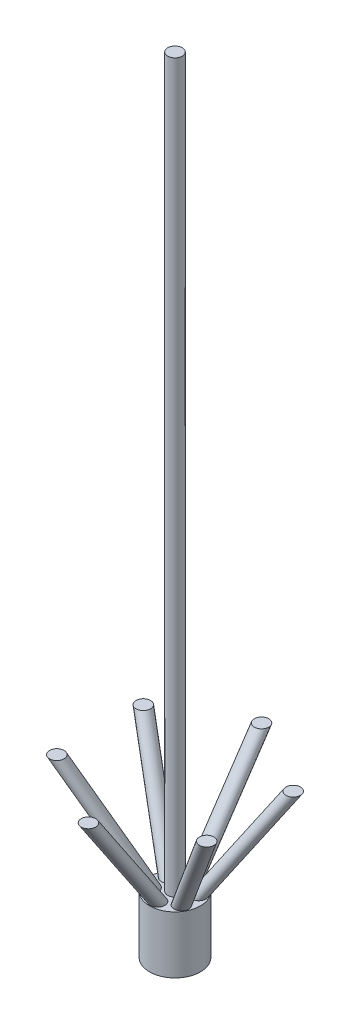
ISO-10303-21;
HEADER;
FILE_DESCRIPTION(('STEP AP214'),'2;1');
FILE_NAME('part.step','',(''),(''),'','','');
FILE_SCHEMA(('AUTOMOTIVE_DESIGN { 1 0 10303 214 1 1 1 1 }'));
ENDSEC;
DATA;
#1=APPLICATION_CONTEXT('core data for automotive mechanical design processes');
#2=APPLICATION_PROTOCOL_DEFINITION('international standard','automotive_design',2000,#1);
#3=PRODUCT_CONTEXT('',#1,'mechanical');
#4=PRODUCT('Part','Part','',(#3));
#5=PRODUCT_RELATED_PRODUCT_CATEGORY('part','',(#4));
#6=PRODUCT_DEFINITION_FORMATION('','',#4);
#7=PRODUCT_DEFINITION_CONTEXT('part definition',#1,'design');
#8=PRODUCT_DEFINITION('design','',#6,#7);
#9=PRODUCT_DEFINITION_SHAPE('','',#8);
#10=(LENGTH_UNIT() NAMED_UNIT(*) SI_UNIT(.MILLI.,.METRE.));
#11=(NAMED_UNIT(*) PLANE_ANGLE_UNIT() SI_UNIT($,.RADIAN.));
#12=(NAMED_UNIT(*) SI_UNIT($,.STERADIAN.) SOLID_ANGLE_UNIT());
#13=UNCERTAINTY_MEASURE_WITH_UNIT(LENGTH_MEASURE(1.E-05),#10,'distance_accuracy_value','');
#14=(GEOMETRIC_REPRESENTATION_CONTEXT(3) GLOBAL_UNCERTAINTY_ASSIGNED_CONTEXT((#13)) GLOBAL_UNIT_ASSIGNED_CONTEXT((#10,
#11,#12)) REPRESENTATION_CONTEXT('',''));
#15=CARTESIAN_POINT('',(0.,0.,0.));
#16=DIRECTION('',(0.,0.,1.));
#17=DIRECTION('',(1.,0.,0.));
#18=AXIS2_PLACEMENT_3D('',#15,#16,#17);
#19=CARTESIAN_POINT('',(0.,1.,0.));
#20=DIRECTION('',(0.,1.,0.));
#21=DIRECTION('',(0.,0.,1.));
#22=AXIS2_PLACEMENT_3D('',#19,#20,#21);
#23=PLANE('',#22);
#24=CARTESIAN_POINT('',(0.263964543073501,1.,0.152399999999997));
#25=DIRECTION('',(0.,1.,0.));
#26=DIRECTION('',(-0.866025403784443,0.,-0.499999999999992));
#27=AXIS2_PLACEMENT_3D('',#24,#25,#26);
#28=CIRCLE('',#27,0.127);
#29=CARTESIAN_POINT('',(0.153979316792877,1.,0.088899999999998));
#30=VERTEX_POINT('',#29);
#31=EDGE_CURVE('E282',#30,#30,#28,.T.);
#32=ORIENTED_EDGE('',*,*,#31,.F.);
#33=EDGE_LOOP('',(#32));
#34=FACE_BOUND('',#33,.T.);
#35=CARTESIAN_POINT('',(-0.263964543073494,1.,0.152399999999997));
#36=DIRECTION('',(0.,1.,0.));
#37=DIRECTION('',(0.866025403784436,0.,-0.500000000000004));
#38=AXIS2_PLACEMENT_3D('',#35,#36,#37);
#39=CIRCLE('',#38,0.127);
#40=CARTESIAN_POINT('',(-0.153979316792871,1.,0.0888999999999965));
#41=VERTEX_POINT('',#40);
#42=EDGE_CURVE('E299',#41,#41,#39,.T.);
#43=ORIENTED_EDGE('',*,*,#42,.F.);
#44=EDGE_LOOP('',(#43));
#45=FACE_BOUND('',#44,.T.);
#46=CARTESIAN_POINT('',(0.,1.,-0.304799999999994));
#47=DIRECTION('',(0.,1.,0.));
#48=DIRECTION('',(0.,0.,1.));
#49=AXIS2_PLACEMENT_3D('',#46,#47,#48);
#50=CIRCLE('',#49,0.127);
#51=CARTESIAN_POINT('',(0.,1.,-0.177799999999994));
#52=VERTEX_POINT('',#51);
#53=EDGE_CURVE('E63',#52,#52,#50,.T.);
#54=ORIENTED_EDGE('',*,*,#53,.F.);
#55=EDGE_LOOP('',(#54));
#56=FACE_BOUND('',#55,.T.);
#57=CARTESIAN_POINT('',(0.,1.,0.));
#58=DIRECTION('',(0.,1.,0.));
#59=DIRECTION('',(0.,0.,1.));
#60=AXIS2_PLACEMENT_3D('',#57,#58,#59);
#61=CIRCLE('',#60,0.4445);
#62=CARTESIAN_POINT('',(0.,1.,0.4445));
#63=VERTEX_POINT('',#62);
#64=EDGE_CURVE('E10',#63,#63,#61,.T.);
#65=ORIENTED_EDGE('',*,*,#64,.T.);
#66=EDGE_LOOP('',(#65));
#67=FACE_BOUND('',#66,.T.);
#68=CARTESIAN_POINT('',(0.,1.,0.));
#69=DIRECTION('',(0.,1.,0.));
#70=DIRECTION('',(0.,0.,1.));
#71=AXIS2_PLACEMENT_3D('',#68,#69,#70);
#72=CIRCLE('',#71,0.127);
#73=CARTESIAN_POINT('',(0.,1.,0.127));
#74=VERTEX_POINT('',#73);
#75=EDGE_CURVE('E55',#74,#74,#72,.T.);
#76=ORIENTED_EDGE('',*,*,#75,.F.);
#77=EDGE_LOOP('',(#76));
#78=FACE_BOUND('',#77,.T.);
#79=CARTESIAN_POINT('',(-0.263964543073494,1.,-0.152399999999997));
#80=DIRECTION('',(0.,1.,0.));
#81=DIRECTION('',(0.86602540378444,0.,0.499999999999998));
#82=AXIS2_PLACEMENT_3D('',#79,#80,#81);
#83=CIRCLE('',#82,0.127);
#84=CARTESIAN_POINT('',(-0.153979316792871,1.,-0.0888999999999972));
#85=VERTEX_POINT('',#84);
#86=EDGE_CURVE('E72',#85,#85,#83,.T.);
#87=ORIENTED_EDGE('',*,*,#86,.F.);
#88=EDGE_LOOP('',(#87));
#89=FACE_BOUND('',#88,.T.);
#90=CARTESIAN_POINT('',(0.,1.,0.304799999999994));
#91=DIRECTION('',(0.,1.,0.));
#92=DIRECTION('',(0.,0.,-1.));
#93=AXIS2_PLACEMENT_3D('',#90,#91,#92);
#94=CIRCLE('',#93,0.127);
#95=CARTESIAN_POINT('',(0.,1.,0.177799999999994));
#96=VERTEX_POINT('',#95);
#97=EDGE_CURVE('E292',#96,#96,#94,.T.);
#98=ORIENTED_EDGE('',*,*,#97,.F.);
#99=EDGE_LOOP('',(#98));
#100=FACE_BOUND('',#99,.T.);
#101=CARTESIAN_POINT('',(0.263964543073494,1.,-0.152399999999997));
#102=DIRECTION('',(0.,1.,0.));
#103=DIRECTION('',(-0.866025403784433,0.,0.50000000000001));
#104=AXIS2_PLACEMENT_3D('',#101,#102,#103);
#105=CIRCLE('',#104,0.127);
#106=CARTESIAN_POINT('',(0.153979316792871,1.,-0.0888999999999957));
#107=VERTEX_POINT('',#106);
#108=EDGE_CURVE('E283',#107,#107,#105,.T.);
#109=ORIENTED_EDGE('',*,*,#108,.F.);
#110=EDGE_LOOP('',(#109));
#111=FACE_BOUND('',#110,.T.);
#112=ADVANCED_FACE('F40',(#34,#45,#56,#67,#78,#89,#100,#111),#23,.T.);
#113=CARTESIAN_POINT('',(0.,1.,0.));
#114=DIRECTION('',(0.,-1.,0.));
#115=DIRECTION('',(0.,0.,-1.));
#116=AXIS2_PLACEMENT_3D('',#113,#114,#115);
#117=CYLINDRICAL_SURFACE('',#116,0.4445);
#118=ORIENTED_EDGE('',*,*,#64,.F.);
#119=EDGE_LOOP('',(#118));
#120=FACE_BOUND('',#119,.T.);
#121=CARTESIAN_POINT('',(0.,0.,0.));
#122=DIRECTION('',(0.,1.,0.));
#123=DIRECTION('',(0.,0.,1.));
#124=AXIS2_PLACEMENT_3D('',#121,#122,#123);
#125=CIRCLE('',#124,0.4445);
#126=CARTESIAN_POINT('',(0.,0.,0.4445));
#127=VERTEX_POINT('',#126);
#128=EDGE_CURVE('E44',#127,#127,#125,.T.);
#129=ORIENTED_EDGE('',*,*,#128,.T.);
#130=EDGE_LOOP('',(#129));
#131=FACE_BOUND('',#130,.T.);
#132=ADVANCED_FACE('F42',(#120,#131),#117,.T.);
#133=CARTESIAN_POINT('',(0.,0.,0.));
#134=DIRECTION('',(0.,1.,0.));
#135=DIRECTION('',(0.,0.,1.));
#136=AXIS2_PLACEMENT_3D('',#133,#134,#135);
#137=PLANE('',#136);
#138=ORIENTED_EDGE('',*,*,#128,.F.);
#139=EDGE_LOOP('',(#138));
#140=FACE_BOUND('',#139,.T.);
#141=ADVANCED_FACE('F89',(#140),#137,.F.);
#142=CARTESIAN_POINT('',(0.,13.7,0.));
#143=DIRECTION('',(0.,-1.,0.));
#144=DIRECTION('',(0.,0.,-1.));
#145=AXIS2_PLACEMENT_3D('',#142,#143,#144);
#146=CYLINDRICAL_SURFACE('',#145,0.127);
#147=CARTESIAN_POINT('',(0.,13.7,0.));
#148=DIRECTION('',(0.,1.,0.));
#149=DIRECTION('',(0.,0.,1.));
#150=AXIS2_PLACEMENT_3D('',#147,#148,#149);
#151=CIRCLE('',#150,0.127);
#152=CARTESIAN_POINT('',(0.,13.7,0.127));
#153=VERTEX_POINT('',#152);
#154=EDGE_CURVE('E53',#153,#153,#151,.T.);
#155=ORIENTED_EDGE('',*,*,#154,.F.);
#156=EDGE_LOOP('',(#155));
#157=FACE_BOUND('',#156,.T.);
#158=ORIENTED_EDGE('',*,*,#75,.T.);
#159=EDGE_LOOP('',(#158));
#160=FACE_BOUND('',#159,.T.);
#161=ADVANCED_FACE('F85',(#157,#160),#146,.T.);
#162=CARTESIAN_POINT('',(0.,13.7,0.));
#163=DIRECTION('',(0.,1.,0.));
#164=DIRECTION('',(0.,0.,1.));
#165=AXIS2_PLACEMENT_3D('',#162,#163,#164);
#166=PLANE('',#165);
#167=ORIENTED_EDGE('',*,*,#154,.T.);
#168=EDGE_LOOP('',(#167));
#169=FACE_BOUND('',#168,.T.);
#170=ADVANCED_FACE('F80',(#169),#166,.T.);
#171=CARTESIAN_POINT('',(0.,2.78989211914633,-1.51209747859335));
#172=DIRECTION('',(0.,1.,0.));
#173=DIRECTION('',(0.,0.,1.));
#174=AXIS2_PLACEMENT_3D('',#171,#172,#173);
#175=CIRCLE('',#174,0.127);
#176=DIRECTION('',(0.,-0.829037572555041,0.559192903470748));
#177=VECTOR('',#176,1.);
#178=SURFACE_OF_LINEAR_EXTRUSION('',#175,#177);
#179=CARTESIAN_POINT('',(0.,2.78989211914633,-1.38509747859335));
#180=VERTEX_POINT('',#179);
#181=EDGE_CURVE('E59',#180,#180,#175,.T.);
#182=ORIENTED_EDGE('',*,*,#181,.F.);
#183=EDGE_LOOP('',(#182));
#184=FACE_BOUND('',#183,.T.);
#185=ORIENTED_EDGE('',*,*,#53,.T.);
#186=EDGE_LOOP('',(#185));
#187=FACE_BOUND('',#186,.T.);
#188=ADVANCED_FACE('F75',(#184,#187),#178,.F.);
#189=CARTESIAN_POINT('',(0.,2.78989211914633,-1.51209747859335));
#190=DIRECTION('',(0.,1.,0.));
#191=DIRECTION('',(0.,0.,1.));
#192=AXIS2_PLACEMENT_3D('',#189,#190,#191);
#193=PLANE('',#192);
#194=ORIENTED_EDGE('',*,*,#181,.T.);
#195=EDGE_LOOP('',(#194));
#196=FACE_BOUND('',#195,.T.);
#197=ADVANCED_FACE('F79',(#196),#193,.T.);
#198=CARTESIAN_POINT('',(-1.30951482946023,2.78989211914633,-0.756048739296675));
#199=DIRECTION('',(0.,1.,0.));
#200=DIRECTION('',(0.86602540378444,0.,0.499999999999998));
#201=AXIS2_PLACEMENT_3D('',#198,#199,#200);
#202=CIRCLE('',#201,0.127);
#203=DIRECTION('',(0.484275260021648,-0.829037572555041,0.279596451735373));
#204=VECTOR('',#203,1.);
#205=SURFACE_OF_LINEAR_EXTRUSION('',#202,#204);
#206=CARTESIAN_POINT('',(-1.19952960317961,2.78989211914633,-0.692548739296675));
#207=VERTEX_POINT('',#206);
#208=EDGE_CURVE('E67',#207,#207,#202,.T.);
#209=ORIENTED_EDGE('',*,*,#208,.F.);
#210=EDGE_LOOP('',(#209));
#211=FACE_BOUND('',#210,.T.);
#212=ORIENTED_EDGE('',*,*,#86,.T.);
#213=EDGE_LOOP('',(#212));
#214=FACE_BOUND('',#213,.T.);
#215=ADVANCED_FACE('F151',(#211,#214),#205,.F.);
#216=CARTESIAN_POINT('',(-1.30951482946023,2.78989211914633,-0.756048739296675));
#217=DIRECTION('',(0.,1.,0.));
#218=DIRECTION('',(0.86602540378444,0.,0.499999999999998));
#219=AXIS2_PLACEMENT_3D('',#216,#217,#218);
#220=PLANE('',#219);
#221=ORIENTED_EDGE('',*,*,#208,.T.);
#222=EDGE_LOOP('',(#221));
#223=FACE_BOUND('',#222,.T.);
#224=ADVANCED_FACE('F160',(#223),#220,.T.);
#225=CARTESIAN_POINT('',(-1.30951482946023,2.78989211914633,0.756048739296675));
#226=DIRECTION('',(0.,1.,0.));
#227=DIRECTION('',(0.866025403784436,0.,-0.500000000000004));
#228=AXIS2_PLACEMENT_3D('',#225,#226,#227);
#229=CIRCLE('',#228,0.127);
#230=DIRECTION('',(0.484275260021646,-0.829037572555041,-0.279596451735376));
#231=VECTOR('',#230,1.);
#232=SURFACE_OF_LINEAR_EXTRUSION('',#229,#231);
#233=CARTESIAN_POINT('',(-1.1995296031796,2.78989211914633,0.692548739296674));
#234=VERTEX_POINT('',#233);
#235=EDGE_CURVE('E303',#234,#234,#229,.T.);
#236=ORIENTED_EDGE('',*,*,#235,.F.);
#237=EDGE_LOOP('',(#236));
#238=FACE_BOUND('',#237,.T.);
#239=ORIENTED_EDGE('',*,*,#42,.T.);
#240=EDGE_LOOP('',(#239));
#241=FACE_BOUND('',#240,.T.);
#242=ADVANCED_FACE('F170',(#238,#241),#232,.F.);
#243=CARTESIAN_POINT('',(-1.30951482946023,2.78989211914633,0.756048739296675));
#244=DIRECTION('',(0.,1.,0.));
#245=DIRECTION('',(0.866025403784436,0.,-0.500000000000004));
#246=AXIS2_PLACEMENT_3D('',#243,#244,#245);
#247=PLANE('',#246);
#248=ORIENTED_EDGE('',*,*,#235,.T.);
#249=EDGE_LOOP('',(#248));
#250=FACE_BOUND('',#249,.T.);
#251=ADVANCED_FACE('F181',(#250),#247,.T.);
#252=CARTESIAN_POINT('',(0.,2.78989211914633,1.51209747859335));
#253=DIRECTION('',(0.,1.,0.));
#254=DIRECTION('',(0.,0.,-1.));
#255=AXIS2_PLACEMENT_3D('',#252,#253,#254);
#256=CIRCLE('',#255,0.127);
#257=DIRECTION('',(0.,-0.829037572555041,-0.559192903470748));
#258=VECTOR('',#257,1.);
#259=SURFACE_OF_LINEAR_EXTRUSION('',#256,#258);
#260=CARTESIAN_POINT('',(0.,2.78989211914633,1.38509747859335));
#261=VERTEX_POINT('',#260);
#262=EDGE_CURVE('E294',#261,#261,#256,.T.);
#263=ORIENTED_EDGE('',*,*,#262,.F.);
#264=EDGE_LOOP('',(#263));
#265=FACE_BOUND('',#264,.T.);
#266=ORIENTED_EDGE('',*,*,#97,.T.);
#267=EDGE_LOOP('',(#266));
#268=FACE_BOUND('',#267,.T.);
#269=ADVANCED_FACE('F192',(#265,#268),#259,.F.);
#270=CARTESIAN_POINT('',(0.,2.78989211914633,1.51209747859335));
#271=DIRECTION('',(0.,1.,0.));
#272=DIRECTION('',(0.,0.,-1.));
#273=AXIS2_PLACEMENT_3D('',#270,#271,#272);
#274=PLANE('',#273);
#275=ORIENTED_EDGE('',*,*,#262,.T.);
#276=EDGE_LOOP('',(#275));
#277=FACE_BOUND('',#276,.T.);
#278=ADVANCED_FACE('F203',(#277),#274,.T.);
#279=CARTESIAN_POINT('',(1.30951482946024,2.78989211914633,0.756048739296661));
#280=DIRECTION('',(0.,1.,0.));
#281=DIRECTION('',(-0.866025403784443,0.,-0.499999999999992));
#282=AXIS2_PLACEMENT_3D('',#279,#280,#281);
#283=CIRCLE('',#282,0.127);
#284=DIRECTION('',(-0.48427526002165,-0.829037572555041,-0.279596451735369));
#285=VECTOR('',#284,1.);
#286=SURFACE_OF_LINEAR_EXTRUSION('',#283,#285);
#287=CARTESIAN_POINT('',(1.19952960317962,2.78989211914633,0.692548739296662));
#288=VERTEX_POINT('',#287);
#289=EDGE_CURVE('E287',#288,#288,#283,.T.);
#290=ORIENTED_EDGE('',*,*,#289,.F.);
#291=EDGE_LOOP('',(#290));
#292=FACE_BOUND('',#291,.T.);
#293=ORIENTED_EDGE('',*,*,#31,.T.);
#294=EDGE_LOOP('',(#293));
#295=FACE_BOUND('',#294,.T.);
#296=ADVANCED_FACE('F214',(#292,#295),#286,.F.);
#297=CARTESIAN_POINT('',(1.30951482946024,2.78989211914633,0.756048739296661));
#298=DIRECTION('',(0.,1.,0.));
#299=DIRECTION('',(-0.866025403784443,0.,-0.499999999999992));
#300=AXIS2_PLACEMENT_3D('',#297,#298,#299);
#301=PLANE('',#300);
#302=ORIENTED_EDGE('',*,*,#289,.T.);
#303=EDGE_LOOP('',(#302));
#304=FACE_BOUND('',#303,.T.);
#305=ADVANCED_FACE('F225',(#304),#301,.T.);
#306=CARTESIAN_POINT('',(1.30951482946022,2.78989211914633,-0.756048739296689));
#307=DIRECTION('',(0.,1.,0.));
#308=DIRECTION('',(-0.866025403784433,0.,0.50000000000001));
#309=AXIS2_PLACEMENT_3D('',#306,#307,#308);
#310=CIRCLE('',#309,0.127);
#311=DIRECTION('',(-0.484275260021644,-0.829037572555041,0.27959645173538));
#312=VECTOR('',#311,1.);
#313=SURFACE_OF_LINEAR_EXTRUSION('',#310,#312);
#314=CARTESIAN_POINT('',(1.1995296031796,2.78989211914633,-0.692548739296687));
#315=VERTEX_POINT('',#314);
#316=EDGE_CURVE('E278',#315,#315,#310,.T.);
#317=ORIENTED_EDGE('',*,*,#316,.F.);
#318=EDGE_LOOP('',(#317));
#319=FACE_BOUND('',#318,.T.);
#320=ORIENTED_EDGE('',*,*,#108,.T.);
#321=EDGE_LOOP('',(#320));
#322=FACE_BOUND('',#321,.T.);
#323=ADVANCED_FACE('F236',(#319,#322),#313,.F.);
#324=CARTESIAN_POINT('',(1.30951482946022,2.78989211914633,-0.756048739296689));
#325=DIRECTION('',(0.,1.,0.));
#326=DIRECTION('',(-0.866025403784433,0.,0.50000000000001));
#327=AXIS2_PLACEMENT_3D('',#324,#325,#326);
#328=PLANE('',#327);
#329=ORIENTED_EDGE('',*,*,#316,.T.);
#330=EDGE_LOOP('',(#329));
#331=FACE_BOUND('',#330,.T.);
#332=ADVANCED_FACE('F247',(#331),#328,.T.);
#333=CLOSED_SHELL('',(#112,#132,#141,#161,#170,#188,#197,#215,#224,#242,#251,#269,#278,#296,
#305,#323,#332));
#334=MANIFOLD_SOLID_BREP('B2',#333);
#335=ADVANCED_BREP_SHAPE_REPRESENTATION('',(#18,#334),#14);
#336=SHAPE_DEFINITION_REPRESENTATION(#9,#335);
ENDSEC;
END-ISO-10303-21;
